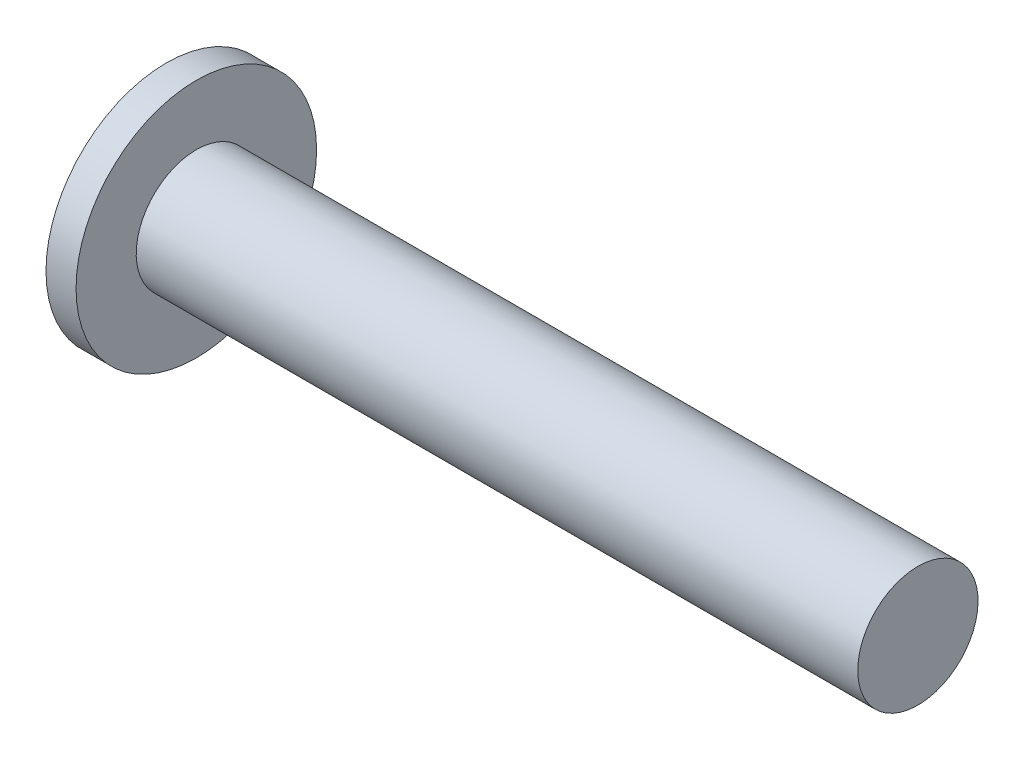
ISO-10303-21;
HEADER;
FILE_DESCRIPTION(('STEP AP214'),'2;1');
FILE_NAME('part.step','',(''),(''),'','','');
FILE_SCHEMA(('AUTOMOTIVE_DESIGN { 1 0 10303 214 1 1 1 1 }'));
ENDSEC;
DATA;
#1=APPLICATION_CONTEXT('core data for automotive mechanical design processes');
#2=APPLICATION_PROTOCOL_DEFINITION('international standard','automotive_design',2000,#1);
#3=PRODUCT_CONTEXT('',#1,'mechanical');
#4=PRODUCT('Part','Part','',(#3));
#5=PRODUCT_RELATED_PRODUCT_CATEGORY('part','',(#4));
#6=PRODUCT_DEFINITION_FORMATION('','',#4);
#7=PRODUCT_DEFINITION_CONTEXT('part definition',#1,'design');
#8=PRODUCT_DEFINITION('design','',#6,#7);
#9=PRODUCT_DEFINITION_SHAPE('','',#8);
#10=(LENGTH_UNIT() NAMED_UNIT(*) SI_UNIT(.MILLI.,.METRE.));
#11=(NAMED_UNIT(*) PLANE_ANGLE_UNIT() SI_UNIT($,.RADIAN.));
#12=(NAMED_UNIT(*) SI_UNIT($,.STERADIAN.) SOLID_ANGLE_UNIT());
#13=UNCERTAINTY_MEASURE_WITH_UNIT(LENGTH_MEASURE(1.E-05),#10,'distance_accuracy_value','');
#14=(GEOMETRIC_REPRESENTATION_CONTEXT(3) GLOBAL_UNCERTAINTY_ASSIGNED_CONTEXT((#13)) GLOBAL_UNIT_ASSIGNED_CONTEXT((#10,
#11,#12)) REPRESENTATION_CONTEXT('',''));
#15=CARTESIAN_POINT('',(0.,0.,0.));
#16=DIRECTION('',(0.,0.,1.));
#17=DIRECTION('',(1.,0.,0.));
#18=AXIS2_PLACEMENT_3D('',#15,#16,#17);
#19=CARTESIAN_POINT('',(0.,0.,0.));
#20=DIRECTION('',(-1.,0.,0.));
#21=DIRECTION('',(0.,-1.,0.));
#22=AXIS2_PLACEMENT_3D('',#19,#20,#21);
#23=PLANE('',#22);
#24=CARTESIAN_POINT('',(0.,0.,0.));
#25=DIRECTION('',(1.,0.,0.));
#26=DIRECTION('',(0.,1.,0.));
#27=AXIS2_PLACEMENT_3D('',#24,#25,#26);
#28=CIRCLE('',#27,40.);
#29=CARTESIAN_POINT('',(0.,40.,0.));
#30=VERTEX_POINT('',#29);
#31=EDGE_CURVE('E10',#30,#30,#28,.T.);
#32=ORIENTED_EDGE('',*,*,#31,.F.);
#33=EDGE_LOOP('',(#32));
#34=FACE_BOUND('',#33,.T.);
#35=ADVANCED_FACE('F41',(#34),#23,.T.);
#36=CARTESIAN_POINT('',(250.,0.,0.));
#37=DIRECTION('',(1.,0.,0.));
#38=DIRECTION('',(0.,1.,0.));
#39=AXIS2_PLACEMENT_3D('',#36,#37,#38);
#40=CYLINDRICAL_SURFACE('',#39,40.);
#41=ORIENTED_EDGE('',*,*,#31,.T.);
#42=EDGE_LOOP('',(#41));
#43=FACE_BOUND('',#42,.T.);
#44=CARTESIAN_POINT('',(10.,0.,0.));
#45=DIRECTION('',(1.,0.,0.));
#46=DIRECTION('',(0.,1.,0.));
#47=AXIS2_PLACEMENT_3D('',#44,#45,#46);
#48=CIRCLE('',#47,40.);
#49=CARTESIAN_POINT('',(10.,40.,0.));
#50=VERTEX_POINT('',#49);
#51=EDGE_CURVE('E48',#50,#50,#48,.T.);
#52=ORIENTED_EDGE('',*,*,#51,.F.);
#53=EDGE_LOOP('',(#52));
#54=FACE_BOUND('',#53,.T.);
#55=ADVANCED_FACE('F77',(#43,#54),#40,.T.);
#56=CARTESIAN_POINT('',(10.,40.,0.));
#57=DIRECTION('',(1.,0.,0.));
#58=DIRECTION('',(0.,1.,0.));
#59=AXIS2_PLACEMENT_3D('',#56,#57,#58);
#60=PLANE('',#59);
#61=ORIENTED_EDGE('',*,*,#51,.T.);
#62=EDGE_LOOP('',(#61));
#63=FACE_BOUND('',#62,.T.);
#64=CARTESIAN_POINT('',(10.,0.,0.));
#65=DIRECTION('',(1.,0.,0.));
#66=DIRECTION('',(0.,1.,0.));
#67=AXIS2_PLACEMENT_3D('',#64,#65,#66);
#68=CIRCLE('',#67,20.);
#69=CARTESIAN_POINT('',(10.,20.,0.));
#70=VERTEX_POINT('',#69);
#71=EDGE_CURVE('E53',#70,#70,#68,.T.);
#72=ORIENTED_EDGE('',*,*,#71,.F.);
#73=EDGE_LOOP('',(#72));
#74=FACE_BOUND('',#73,.T.);
#75=ADVANCED_FACE('F69',(#63,#74),#60,.T.);
#76=CARTESIAN_POINT('',(250.,0.,0.));
#77=DIRECTION('',(1.,0.,0.));
#78=DIRECTION('',(0.,1.,0.));
#79=AXIS2_PLACEMENT_3D('',#76,#77,#78);
#80=CYLINDRICAL_SURFACE('',#79,20.);
#81=ORIENTED_EDGE('',*,*,#71,.T.);
#82=EDGE_LOOP('',(#81));
#83=FACE_BOUND('',#82,.T.);
#84=CARTESIAN_POINT('',(250.,0.,0.));
#85=DIRECTION('',(1.,0.,0.));
#86=DIRECTION('',(0.,1.,0.));
#87=AXIS2_PLACEMENT_3D('',#84,#85,#86);
#88=CIRCLE('',#87,20.);
#89=CARTESIAN_POINT('',(250.,20.,0.));
#90=VERTEX_POINT('',#89);
#91=EDGE_CURVE('E58',#90,#90,#88,.T.);
#92=ORIENTED_EDGE('',*,*,#91,.F.);
#93=EDGE_LOOP('',(#92));
#94=FACE_BOUND('',#93,.T.);
#95=ADVANCED_FACE('F67',(#83,#94),#80,.T.);
#96=CARTESIAN_POINT('',(250.,20.,0.));
#97=DIRECTION('',(1.,0.,0.));
#98=DIRECTION('',(0.,1.,0.));
#99=AXIS2_PLACEMENT_3D('',#96,#97,#98);
#100=PLANE('',#99);
#101=ORIENTED_EDGE('',*,*,#91,.T.);
#102=EDGE_LOOP('',(#101));
#103=FACE_BOUND('',#102,.T.);
#104=ADVANCED_FACE('F65',(#103),#100,.T.);
#105=CLOSED_SHELL('',(#35,#55,#75,#95,#104));
#106=MANIFOLD_SOLID_BREP('B2',#105);
#107=ADVANCED_BREP_SHAPE_REPRESENTATION('',(#18,#106),#14);
#108=SHAPE_DEFINITION_REPRESENTATION(#9,#107);
ENDSEC;
END-ISO-10303-21;
